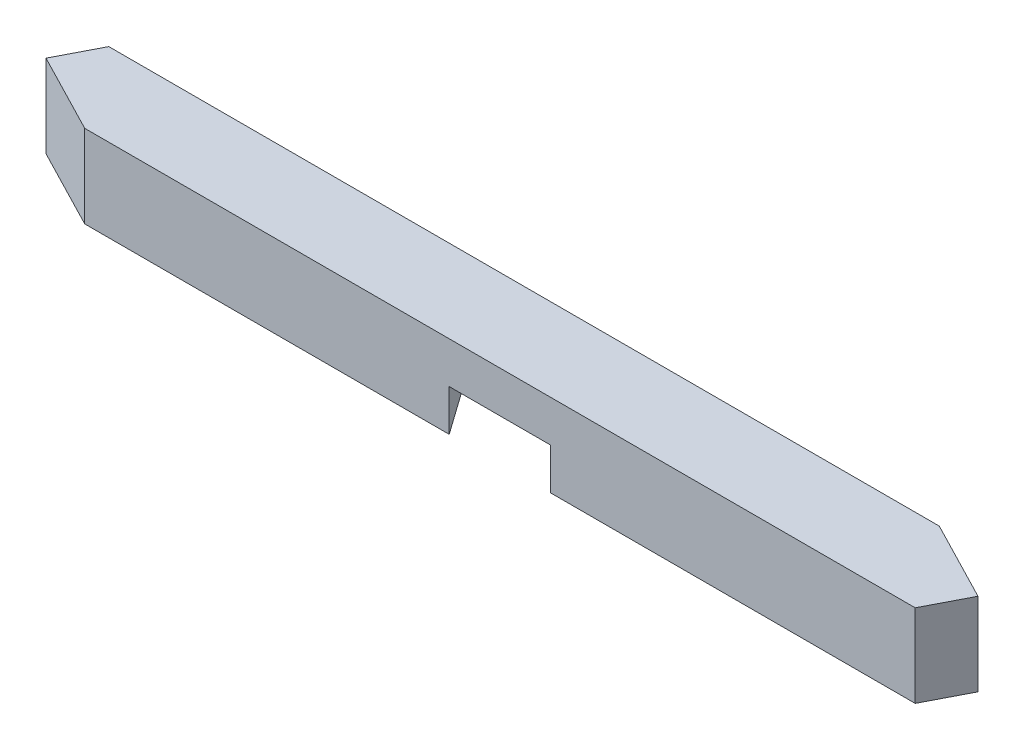
ISO-10303-21;
HEADER;
FILE_DESCRIPTION(('STEP AP214'),'2;1');
FILE_NAME('part.step','',(''),(''),'','','');
FILE_SCHEMA(('AUTOMOTIVE_DESIGN { 1 0 10303 214 1 1 1 1 }'));
ENDSEC;
DATA;
#1=APPLICATION_CONTEXT('core data for automotive mechanical design processes');
#2=APPLICATION_PROTOCOL_DEFINITION('international standard','automotive_design',2000,#1);
#3=PRODUCT_CONTEXT('',#1,'mechanical');
#4=PRODUCT('Part','Part','',(#3));
#5=PRODUCT_RELATED_PRODUCT_CATEGORY('part','',(#4));
#6=PRODUCT_DEFINITION_FORMATION('','',#4);
#7=PRODUCT_DEFINITION_CONTEXT('part definition',#1,'design');
#8=PRODUCT_DEFINITION('design','',#6,#7);
#9=PRODUCT_DEFINITION_SHAPE('','',#8);
#10=(LENGTH_UNIT() NAMED_UNIT(*) SI_UNIT(.MILLI.,.METRE.));
#11=(NAMED_UNIT(*) PLANE_ANGLE_UNIT() SI_UNIT($,.RADIAN.));
#12=(NAMED_UNIT(*) SI_UNIT($,.STERADIAN.) SOLID_ANGLE_UNIT());
#13=UNCERTAINTY_MEASURE_WITH_UNIT(LENGTH_MEASURE(1.E-05),#10,'distance_accuracy_value','');
#14=(GEOMETRIC_REPRESENTATION_CONTEXT(3) GLOBAL_UNCERTAINTY_ASSIGNED_CONTEXT((#13)) GLOBAL_UNIT_ASSIGNED_CONTEXT((#10,
#11,#12)) REPRESENTATION_CONTEXT('',''));
#15=CARTESIAN_POINT('',(0.,0.,0.));
#16=DIRECTION('',(0.,0.,1.));
#17=DIRECTION('',(1.,0.,0.));
#18=AXIS2_PLACEMENT_3D('',#15,#16,#17);
#19=CARTESIAN_POINT('',(209.502933862269,19.05,9.525));
#20=DIRECTION('',(0.,0.,-1.));
#21=DIRECTION('',(-1.,0.,0.));
#22=AXIS2_PLACEMENT_3D('',#19,#20,#21);
#23=PLANE('',#22);
#24=DIRECTION('',(0.,-1.,0.));
#25=VECTOR('',#24,1.);
#26=CARTESIAN_POINT('',(102.290841931134,19.05,9.52500000000001));
#27=LINE('',#26,#25);
#28=CARTESIAN_POINT('',(102.290841931134,9.525,9.525));
#29=VERTEX_POINT('',#28);
#30=CARTESIAN_POINT('',(102.290841931134,0.,9.52500000000003));
#31=VERTEX_POINT('',#30);
#32=EDGE_CURVE('E174',#29,#31,#27,.T.);
#33=ORIENTED_EDGE('',*,*,#32,.F.);
#34=DIRECTION('',(1.,0.,0.));
#35=VECTOR('',#34,1.);
#36=CARTESIAN_POINT('',(209.502933862269,9.525,9.525));
#37=LINE('',#36,#35);
#38=CARTESIAN_POINT('',(125.647575802102,9.525,9.52500000000002));
#39=VERTEX_POINT('',#38);
#40=EDGE_CURVE('E138',#29,#39,#37,.T.);
#41=ORIENTED_EDGE('',*,*,#40,.T.);
#42=DIRECTION('',(0.,1.,0.));
#43=VECTOR('',#42,1.);
#44=CARTESIAN_POINT('',(125.647575802102,19.05,9.52500000000001));
#45=LINE('',#44,#43);
#46=CARTESIAN_POINT('',(125.647575802102,0.,9.52500000000001));
#47=VERTEX_POINT('',#46);
#48=EDGE_CURVE('E209',#47,#39,#45,.T.);
#49=ORIENTED_EDGE('',*,*,#48,.F.);
#50=DIRECTION('',(1.,0.,0.));
#51=VECTOR('',#50,1.);
#52=CARTESIAN_POINT('',(209.502933862269,0.,9.525));
#53=LINE('',#52,#51);
#54=CARTESIAN_POINT('',(209.502933862269,0.,9.525));
#55=VERTEX_POINT('',#54);
#56=EDGE_CURVE('E137',#47,#55,#53,.T.);
#57=ORIENTED_EDGE('',*,*,#56,.T.);
#58=DIRECTION('',(0.,-1.,0.));
#59=VECTOR('',#58,1.);
#60=CARTESIAN_POINT('',(209.502933862269,19.05,9.525));
#61=LINE('',#60,#59);
#62=CARTESIAN_POINT('',(209.502933862269,19.05,9.525));
#63=VERTEX_POINT('',#62);
#64=EDGE_CURVE('E153',#63,#55,#61,.T.);
#65=ORIENTED_EDGE('',*,*,#64,.F.);
#66=DIRECTION('',(1.,0.,0.));
#67=VECTOR('',#66,1.);
#68=CARTESIAN_POINT('',(209.502933862269,19.05,9.525));
#69=LINE('',#68,#67);
#70=CARTESIAN_POINT('',(18.4354838709678,19.05,9.52500000000002));
#71=VERTEX_POINT('',#70);
#72=EDGE_CURVE('E95',#71,#63,#69,.T.);
#73=ORIENTED_EDGE('',*,*,#72,.F.);
#74=DIRECTION('',(0.,-1.,0.));
#75=VECTOR('',#74,1.);
#76=CARTESIAN_POINT('',(18.4354838709678,19.05,9.52500000000002));
#77=LINE('',#76,#75);
#78=CARTESIAN_POINT('',(18.4354838709678,0.,9.52500000000002));
#79=VERTEX_POINT('',#78);
#80=EDGE_CURVE('E156',#71,#79,#77,.T.);
#81=ORIENTED_EDGE('',*,*,#80,.T.);
#82=EDGE_CURVE('E139',#79,#31,#53,.T.);
#83=ORIENTED_EDGE('',*,*,#82,.T.);
#84=EDGE_LOOP('',(#33,#41,#49,#57,#65,#73,#81,#83));
#85=FACE_BOUND('',#84,.T.);
#86=ADVANCED_FACE('F35',(#85),#23,.F.);
#87=CARTESIAN_POINT('',(4.92125,19.05,-9.52500000000001));
#88=DIRECTION('',(0.,0.,1.));
#89=DIRECTION('',(1.,0.,0.));
#90=AXIS2_PLACEMENT_3D('',#87,#88,#89);
#91=PLANE('',#90);
#92=DIRECTION('',(0.,1.,0.));
#93=VECTOR('',#92,1.);
#94=CARTESIAN_POINT('',(88.7766080601667,19.05,-9.525));
#95=LINE('',#94,#93);
#96=CARTESIAN_POINT('',(88.7766080601667,0.,-9.52500000000001));
#97=VERTEX_POINT('',#96);
#98=CARTESIAN_POINT('',(88.7766080601667,9.525,-9.52500000000001));
#99=VERTEX_POINT('',#98);
#100=EDGE_CURVE('E213',#97,#99,#95,.T.);
#101=ORIENTED_EDGE('',*,*,#100,.F.);
#102=DIRECTION('',(-1.,0.,0.));
#103=VECTOR('',#102,1.);
#104=CARTESIAN_POINT('',(4.92125,0.,-9.52500000000001));
#105=LINE('',#104,#103);
#106=CARTESIAN_POINT('',(4.92125,0.,-9.52500000000001));
#107=VERTEX_POINT('',#106);
#108=EDGE_CURVE('E145',#97,#107,#105,.T.);
#109=ORIENTED_EDGE('',*,*,#108,.T.);
#110=DIRECTION('',(0.,-1.,0.));
#111=VECTOR('',#110,1.);
#112=CARTESIAN_POINT('',(4.92125,19.05,-9.52500000000001));
#113=LINE('',#112,#111);
#114=CARTESIAN_POINT('',(4.92125,19.05,-9.52500000000001));
#115=VERTEX_POINT('',#114);
#116=EDGE_CURVE('E125',#115,#107,#113,.T.);
#117=ORIENTED_EDGE('',*,*,#116,.F.);
#118=DIRECTION('',(-1.,0.,0.));
#119=VECTOR('',#118,1.);
#120=CARTESIAN_POINT('',(4.92125,19.05,-9.52500000000001));
#121=LINE('',#120,#119);
#122=CARTESIAN_POINT('',(195.988699991301,19.05,-9.525));
#123=VERTEX_POINT('',#122);
#124=EDGE_CURVE('E108',#123,#115,#121,.T.);
#125=ORIENTED_EDGE('',*,*,#124,.F.);
#126=DIRECTION('',(0.,-1.,0.));
#127=VECTOR('',#126,1.);
#128=CARTESIAN_POINT('',(195.988699991301,19.05,-9.525));
#129=LINE('',#128,#127);
#130=CARTESIAN_POINT('',(195.988699991301,0.,-9.525));
#131=VERTEX_POINT('',#130);
#132=EDGE_CURVE('E117',#123,#131,#129,.T.);
#133=ORIENTED_EDGE('',*,*,#132,.T.);
#134=CARTESIAN_POINT('',(112.133341931134,0.,-9.52500000000001));
#135=VERTEX_POINT('',#134);
#136=EDGE_CURVE('E146',#131,#135,#105,.T.);
#137=ORIENTED_EDGE('',*,*,#136,.T.);
#138=DIRECTION('',(0.,-1.,0.));
#139=VECTOR('',#138,1.);
#140=CARTESIAN_POINT('',(112.133341931134,19.05,-9.525));
#141=LINE('',#140,#139);
#142=CARTESIAN_POINT('',(112.133341931134,9.525,-9.525));
#143=VERTEX_POINT('',#142);
#144=EDGE_CURVE('E50',#143,#135,#141,.T.);
#145=ORIENTED_EDGE('',*,*,#144,.F.);
#146=DIRECTION('',(-1.,0.,0.));
#147=VECTOR('',#146,1.);
#148=CARTESIAN_POINT('',(4.92125,9.525,-9.52500000000001));
#149=LINE('',#148,#147);
#150=EDGE_CURVE('E11',#143,#99,#149,.T.);
#151=ORIENTED_EDGE('',*,*,#150,.T.);
#152=EDGE_LOOP('',(#101,#109,#117,#125,#133,#137,#145,#151));
#153=FACE_BOUND('',#152,.T.);
#154=ADVANCED_FACE('F128',(#153),#91,.F.);
#155=CARTESIAN_POINT('',(0.,0.,0.));
#156=DIRECTION('',(0.,-1.,0.));
#157=DIRECTION('',(0.,0.,-1.));
#158=AXIS2_PLACEMENT_3D('',#155,#156,#157);
#159=PLANE('',#158);
#160=ORIENTED_EDGE('',*,*,#108,.F.);
#161=DIRECTION('',(0.578601183950889,0.,0.815610611707958));
#162=VECTOR('',#161,1.);
#163=CARTESIAN_POINT('',(63.5510085425752,0.,-45.0836321354453));
#164=LINE('',#163,#162);
#165=EDGE_CURVE('E43',#97,#31,#164,.T.);
#166=ORIENTED_EDGE('',*,*,#165,.T.);
#167=ORIENTED_EDGE('',*,*,#82,.F.);
#168=DIRECTION('',(0.888425906857428,0.,0.459020051876338));
#169=VECTOR('',#168,1.);
#170=CARTESIAN_POINT('',(18.4354838709678,0.,9.52500000000002));
#171=LINE('',#170,#169);
#172=CARTESIAN_POINT('',(0.,0.,0.));
#173=VERTEX_POINT('',#172);
#174=EDGE_CURVE('E134',#173,#79,#171,.T.);
#175=ORIENTED_EDGE('',*,*,#174,.F.);
#176=DIRECTION('',(-0.459020051876338,0.,0.888425906857429));
#177=VECTOR('',#176,1.);
#178=CARTESIAN_POINT('',(0.,0.,0.));
#179=LINE('',#178,#177);
#180=EDGE_CURVE('E86',#107,#173,#179,.T.);
#181=ORIENTED_EDGE('',*,*,#180,.F.);
#182=EDGE_LOOP('',(#160,#166,#167,#175,#181));
#183=FACE_BOUND('',#182,.T.);
#184=ADVANCED_FACE('F164',(#183),#159,.T.);
#185=ORIENTED_EDGE('',*,*,#56,.F.);
#186=DIRECTION('',(-0.578601183950888,0.,-0.815610611707958));
#187=VECTOR('',#186,1.);
#188=CARTESIAN_POINT('',(79.0883906956118,0.,-56.1059846897096));
#189=LINE('',#188,#187);
#190=EDGE_CURVE('E158',#47,#135,#189,.T.);
#191=ORIENTED_EDGE('',*,*,#190,.T.);
#192=ORIENTED_EDGE('',*,*,#136,.F.);
#193=DIRECTION('',(-0.888425906857427,0.,-0.45902005187634));
#194=VECTOR('',#193,1.);
#195=CARTESIAN_POINT('',(195.988699991301,0.,-9.525));
#196=LINE('',#195,#194);
#197=CARTESIAN_POINT('',(214.424183862269,0.,0.));
#198=VERTEX_POINT('',#197);
#199=EDGE_CURVE('E120',#198,#131,#196,.T.);
#200=ORIENTED_EDGE('',*,*,#199,.F.);
#201=DIRECTION('',(0.459020051876333,0.,-0.888425906857431));
#202=VECTOR('',#201,1.);
#203=CARTESIAN_POINT('',(214.424183862269,0.,0.));
#204=LINE('',#203,#202);
#205=EDGE_CURVE('E142',#55,#198,#204,.T.);
#206=ORIENTED_EDGE('',*,*,#205,.F.);
#207=EDGE_LOOP('',(#185,#191,#192,#200,#206));
#208=FACE_BOUND('',#207,.T.);
#209=ADVANCED_FACE('F201',(#208),#159,.T.);
#210=CARTESIAN_POINT('',(18.4354838709678,19.05,9.52500000000002));
#211=DIRECTION('',(0.459020051876338,0.,-0.888425906857429));
#212=DIRECTION('',(-0.888425906857429,0.,-0.459020051876338));
#213=AXIS2_PLACEMENT_3D('',#210,#211,#212);
#214=PLANE('',#213);
#215=ORIENTED_EDGE('',*,*,#174,.T.);
#216=ORIENTED_EDGE('',*,*,#80,.F.);
#217=DIRECTION('',(0.888425906857428,0.,0.459020051876338));
#218=VECTOR('',#217,1.);
#219=CARTESIAN_POINT('',(18.4354838709678,19.05,9.52500000000002));
#220=LINE('',#219,#218);
#221=CARTESIAN_POINT('',(0.,19.05,0.));
#222=VERTEX_POINT('',#221);
#223=EDGE_CURVE('E149',#222,#71,#220,.T.);
#224=ORIENTED_EDGE('',*,*,#223,.F.);
#225=DIRECTION('',(0.,-1.,0.));
#226=VECTOR('',#225,1.);
#227=CARTESIAN_POINT('',(0.,19.05,0.));
#228=LINE('',#227,#226);
#229=EDGE_CURVE('E130',#222,#173,#228,.T.);
#230=ORIENTED_EDGE('',*,*,#229,.T.);
#231=EDGE_LOOP('',(#215,#216,#224,#230));
#232=FACE_BOUND('',#231,.T.);
#233=ADVANCED_FACE('F37',(#232),#214,.F.);
#234=CARTESIAN_POINT('',(214.424183862269,19.05,0.));
#235=DIRECTION('',(-0.888425906857431,0.,-0.459020051876333));
#236=DIRECTION('',(-0.459020051876333,0.,0.888425906857431));
#237=AXIS2_PLACEMENT_3D('',#234,#235,#236);
#238=PLANE('',#237);
#239=ORIENTED_EDGE('',*,*,#205,.T.);
#240=DIRECTION('',(0.,-1.,0.));
#241=VECTOR('',#240,1.);
#242=CARTESIAN_POINT('',(214.424183862269,19.05,0.));
#243=LINE('',#242,#241);
#244=CARTESIAN_POINT('',(214.424183862269,19.05,0.));
#245=VERTEX_POINT('',#244);
#246=EDGE_CURVE('E124',#245,#198,#243,.T.);
#247=ORIENTED_EDGE('',*,*,#246,.F.);
#248=DIRECTION('',(0.459020051876333,0.,-0.888425906857431));
#249=VECTOR('',#248,1.);
#250=CARTESIAN_POINT('',(214.424183862269,19.05,0.));
#251=LINE('',#250,#249);
#252=EDGE_CURVE('E111',#63,#245,#251,.T.);
#253=ORIENTED_EDGE('',*,*,#252,.F.);
#254=ORIENTED_EDGE('',*,*,#64,.T.);
#255=EDGE_LOOP('',(#239,#247,#253,#254));
#256=FACE_BOUND('',#255,.T.);
#257=ADVANCED_FACE('F187',(#256),#238,.F.);
#258=CARTESIAN_POINT('',(195.988699991301,19.05,-9.525));
#259=DIRECTION('',(-0.45902005187634,0.,0.888425906857427));
#260=DIRECTION('',(0.888425906857427,0.,0.45902005187634));
#261=AXIS2_PLACEMENT_3D('',#258,#259,#260);
#262=PLANE('',#261);
#263=ORIENTED_EDGE('',*,*,#199,.T.);
#264=ORIENTED_EDGE('',*,*,#132,.F.);
#265=DIRECTION('',(-0.888425906857427,0.,-0.45902005187634));
#266=VECTOR('',#265,1.);
#267=CARTESIAN_POINT('',(195.988699991301,19.05,-9.525));
#268=LINE('',#267,#266);
#269=EDGE_CURVE('E104',#245,#123,#268,.T.);
#270=ORIENTED_EDGE('',*,*,#269,.F.);
#271=ORIENTED_EDGE('',*,*,#246,.T.);
#272=EDGE_LOOP('',(#263,#264,#270,#271));
#273=FACE_BOUND('',#272,.T.);
#274=ADVANCED_FACE('F118',(#273),#262,.F.);
#275=CARTESIAN_POINT('',(0.,19.05,0.));
#276=DIRECTION('',(0.888425906857428,0.,0.459020051876338));
#277=DIRECTION('',(0.459020051876338,0.,-0.888425906857428));
#278=AXIS2_PLACEMENT_3D('',#275,#276,#277);
#279=PLANE('',#278);
#280=ORIENTED_EDGE('',*,*,#180,.T.);
#281=ORIENTED_EDGE('',*,*,#229,.F.);
#282=DIRECTION('',(-0.459020051876338,0.,0.888425906857429));
#283=VECTOR('',#282,1.);
#284=CARTESIAN_POINT('',(0.,19.05,0.));
#285=LINE('',#284,#283);
#286=EDGE_CURVE('E59',#115,#222,#285,.T.);
#287=ORIENTED_EDGE('',*,*,#286,.F.);
#288=ORIENTED_EDGE('',*,*,#116,.T.);
#289=EDGE_LOOP('',(#280,#281,#287,#288));
#290=FACE_BOUND('',#289,.T.);
#291=ADVANCED_FACE('F178',(#290),#279,.F.);
#292=CARTESIAN_POINT('',(0.,19.05,0.));
#293=DIRECTION('',(0.,-1.,0.));
#294=DIRECTION('',(0.,0.,-1.));
#295=AXIS2_PLACEMENT_3D('',#292,#293,#294);
#296=PLANE('',#295);
#297=ORIENTED_EDGE('',*,*,#223,.T.);
#298=ORIENTED_EDGE('',*,*,#72,.T.);
#299=ORIENTED_EDGE('',*,*,#252,.T.);
#300=ORIENTED_EDGE('',*,*,#269,.T.);
#301=ORIENTED_EDGE('',*,*,#124,.T.);
#302=ORIENTED_EDGE('',*,*,#286,.T.);
#303=EDGE_LOOP('',(#297,#298,#299,#300,#301,#302));
#304=FACE_BOUND('',#303,.T.);
#305=ADVANCED_FACE('F106',(#304),#296,.F.);
#306=CARTESIAN_POINT('',(0.,9.525,0.));
#307=DIRECTION('',(0.,1.,0.));
#308=DIRECTION('',(0.,0.,1.));
#309=AXIS2_PLACEMENT_3D('',#306,#307,#308);
#310=PLANE('',#309);
#311=DIRECTION('',(0.578601183950889,0.,0.815610611707958));
#312=VECTOR('',#311,1.);
#313=CARTESIAN_POINT('',(40.2577986059286,9.525,-77.9183198824424));
#314=LINE('',#313,#312);
#315=EDGE_CURVE('E215',#99,#29,#314,.T.);
#316=ORIENTED_EDGE('',*,*,#315,.F.);
#317=ORIENTED_EDGE('',*,*,#150,.F.);
#318=DIRECTION('',(-0.578601183950888,0.,-0.815610611707959));
#319=VECTOR('',#318,1.);
#320=CARTESIAN_POINT('',(174.16638525634,9.525,77.9183198824423));
#321=LINE('',#320,#319);
#322=EDGE_CURVE('E210',#39,#143,#321,.T.);
#323=ORIENTED_EDGE('',*,*,#322,.F.);
#324=ORIENTED_EDGE('',*,*,#40,.F.);
#325=EDGE_LOOP('',(#316,#317,#323,#324));
#326=FACE_BOUND('',#325,.T.);
#327=ADVANCED_FACE('F185',(#326),#310,.F.);
#328=CARTESIAN_POINT('',(40.2577986059286,9.525,-77.9183198824424));
#329=DIRECTION('',(0.815610611707958,0.,-0.578601183950889));
#330=DIRECTION('',(-0.578601183950889,0.,-0.815610611707958));
#331=AXIS2_PLACEMENT_3D('',#328,#329,#330);
#332=PLANE('',#331);
#333=ORIENTED_EDGE('',*,*,#32,.T.);
#334=ORIENTED_EDGE('',*,*,#165,.F.);
#335=ORIENTED_EDGE('',*,*,#100,.T.);
#336=ORIENTED_EDGE('',*,*,#315,.T.);
#337=EDGE_LOOP('',(#333,#334,#335,#336));
#338=FACE_BOUND('',#337,.T.);
#339=ADVANCED_FACE('F233',(#338),#332,.T.);
#340=CARTESIAN_POINT('',(174.16638525634,9.525,77.9183198824423));
#341=DIRECTION('',(-0.815610611707958,0.,0.578601183950888));
#342=DIRECTION('',(0.578601183950888,0.,0.815610611707958));
#343=AXIS2_PLACEMENT_3D('',#340,#341,#342);
#344=PLANE('',#343);
#345=ORIENTED_EDGE('',*,*,#48,.T.);
#346=ORIENTED_EDGE('',*,*,#322,.T.);
#347=ORIENTED_EDGE('',*,*,#144,.T.);
#348=ORIENTED_EDGE('',*,*,#190,.F.);
#349=EDGE_LOOP('',(#345,#346,#347,#348));
#350=FACE_BOUND('',#349,.T.);
#351=ADVANCED_FACE('F235',(#350),#344,.T.);
#352=CLOSED_SHELL('',(#86,#154,#184,#209,#233,#257,#274,#291,#305,#327,#339,#351));
#353=MANIFOLD_SOLID_BREP('B2',#352);
#354=ADVANCED_BREP_SHAPE_REPRESENTATION('',(#18,#353),#14);
#355=SHAPE_DEFINITION_REPRESENTATION(#9,#354);
ENDSEC;
END-ISO-10303-21;
